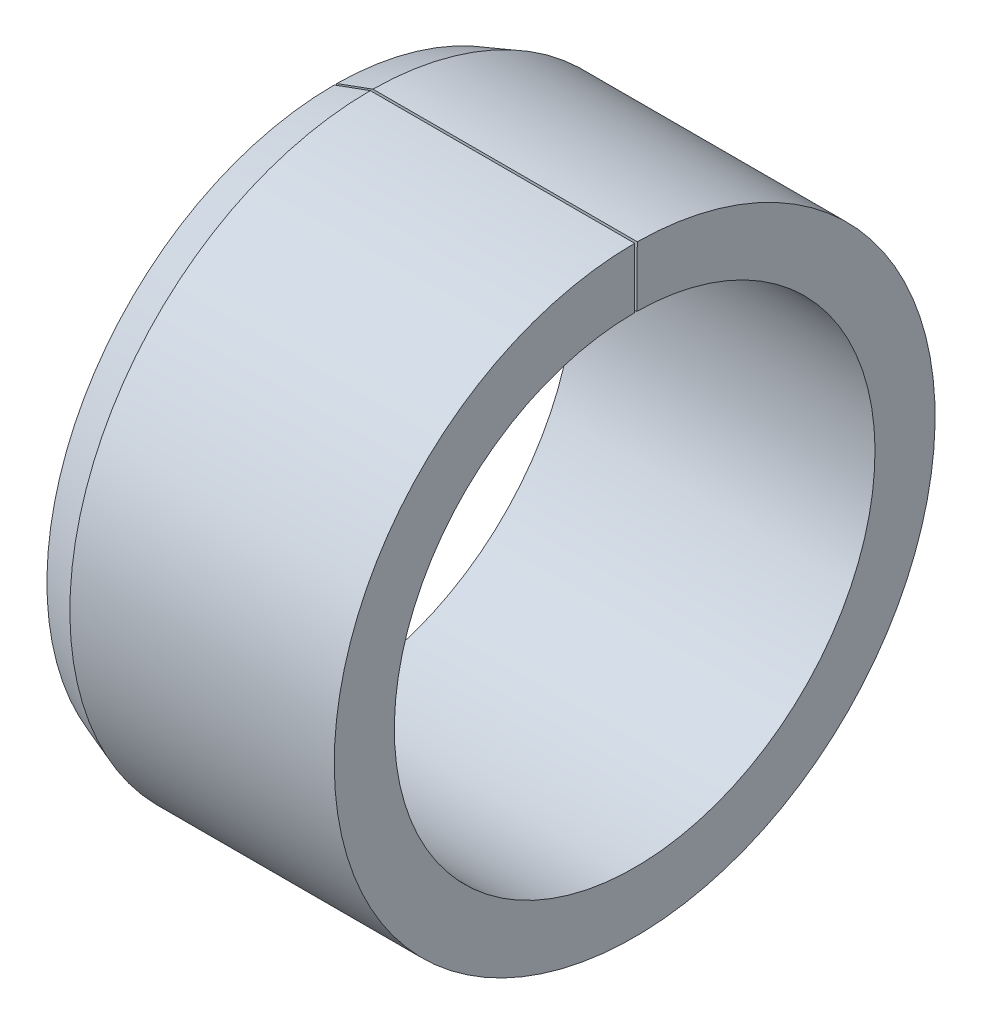
ISO-10303-21;
HEADER;
FILE_DESCRIPTION(('STEP AP214'),'2;1');
FILE_NAME('part.step','',(''),(''),'','','');
FILE_SCHEMA(('AUTOMOTIVE_DESIGN { 1 0 10303 214 1 1 1 1 }'));
ENDSEC;
DATA;
#1=APPLICATION_CONTEXT('core data for automotive mechanical design processes');
#2=APPLICATION_PROTOCOL_DEFINITION('international standard','automotive_design',2000,#1);
#3=PRODUCT_CONTEXT('',#1,'mechanical');
#4=PRODUCT('Part','Part','',(#3));
#5=PRODUCT_RELATED_PRODUCT_CATEGORY('part','',(#4));
#6=PRODUCT_DEFINITION_FORMATION('','',#4);
#7=PRODUCT_DEFINITION_CONTEXT('part definition',#1,'design');
#8=PRODUCT_DEFINITION('design','',#6,#7);
#9=PRODUCT_DEFINITION_SHAPE('','',#8);
#10=(LENGTH_UNIT() NAMED_UNIT(*) SI_UNIT(.MILLI.,.METRE.));
#11=(NAMED_UNIT(*) PLANE_ANGLE_UNIT() SI_UNIT($,.RADIAN.));
#12=(NAMED_UNIT(*) SI_UNIT($,.STERADIAN.) SOLID_ANGLE_UNIT());
#13=UNCERTAINTY_MEASURE_WITH_UNIT(LENGTH_MEASURE(1.E-05),#10,'distance_accuracy_value','');
#14=(GEOMETRIC_REPRESENTATION_CONTEXT(3) GLOBAL_UNCERTAINTY_ASSIGNED_CONTEXT((#13)) GLOBAL_UNIT_ASSIGNED_CONTEXT((#10,
#11,#12)) REPRESENTATION_CONTEXT('',''));
#15=CARTESIAN_POINT('',(0.,0.,0.));
#16=DIRECTION('',(0.,0.,1.));
#17=DIRECTION('',(1.,0.,0.));
#18=AXIS2_PLACEMENT_3D('',#15,#16,#17);
#19=CARTESIAN_POINT('',(5.,2.4665615131487,0.));
#20=DIRECTION('',(0.,0.,1.));
#21=DIRECTION('',(1.,0.,0.));
#22=AXIS2_PLACEMENT_3D('',#19,#20,#21);
#23=PLANE('',#22);
#24=DIRECTION('',(0.,1.,0.));
#25=VECTOR('',#24,1.);
#26=CARTESIAN_POINT('',(5.,2.4665615131487,0.));
#27=LINE('',#26,#25);
#28=CARTESIAN_POINT('',(5.,4.,0.));
#29=VERTEX_POINT('',#28);
#30=CARTESIAN_POINT('',(5.,5.,0.));
#31=VERTEX_POINT('',#30);
#32=EDGE_CURVE('E91',#29,#31,#27,.T.);
#33=ORIENTED_EDGE('',*,*,#32,.F.);
#34=DIRECTION('',(-1.,0.,0.));
#35=VECTOR('',#34,1.);
#36=CARTESIAN_POINT('',(5.,4.,0.));
#37=LINE('',#36,#35);
#38=CARTESIAN_POINT('',(0.,4.,0.));
#39=VERTEX_POINT('',#38);
#40=EDGE_CURVE('E85',#29,#39,#37,.T.);
#41=ORIENTED_EDGE('',*,*,#40,.T.);
#42=DIRECTION('',(0.,1.,0.));
#43=VECTOR('',#42,1.);
#44=CARTESIAN_POINT('',(0.,0.,0.));
#45=LINE('',#44,#43);
#46=CARTESIAN_POINT('',(0.,4.78161785944028,0.));
#47=VERTEX_POINT('',#46);
#48=EDGE_CURVE('E87',#39,#47,#45,.T.);
#49=ORIENTED_EDGE('',*,*,#48,.T.);
#50=DIRECTION('',(-0.939692620785908,-0.342020143325668,0.));
#51=VECTOR('',#50,1.);
#52=CARTESIAN_POINT('',(0.6,5.,0.));
#53=LINE('',#52,#51);
#54=CARTESIAN_POINT('',(0.6,5.,0.));
#55=VERTEX_POINT('',#54);
#56=EDGE_CURVE('E115',#55,#47,#53,.T.);
#57=ORIENTED_EDGE('',*,*,#56,.F.);
#58=DIRECTION('',(1.,0.,0.));
#59=VECTOR('',#58,1.);
#60=CARTESIAN_POINT('',(0.6,5.,0.));
#61=LINE('',#60,#59);
#62=EDGE_CURVE('E47',#55,#31,#61,.T.);
#63=ORIENTED_EDGE('',*,*,#62,.T.);
#64=EDGE_LOOP('',(#33,#41,#49,#57,#63));
#65=FACE_BOUND('',#64,.T.);
#66=ADVANCED_FACE('F39',(#65),#23,.F.);
#67=CARTESIAN_POINT('',(5.,0.,0.));
#68=DIRECTION('',(-1.,0.,0.));
#69=DIRECTION('',(0.,1.,0.));
#70=AXIS2_PLACEMENT_3D('',#67,#68,#69);
#71=CYLINDRICAL_SURFACE('',#70,5.);
#72=DIRECTION('',(1.,0.,0.));
#73=VECTOR('',#72,1.);
#74=CARTESIAN_POINT('',(0.6,4.99980961532086,-0.0436326774918726));
#75=LINE('',#74,#73);
#76=CARTESIAN_POINT('',(0.6,4.99980961532086,-0.0436326774918726));
#77=VERTEX_POINT('',#76);
#78=CARTESIAN_POINT('',(5.,4.99980961532086,-0.0436326774918726));
#79=VERTEX_POINT('',#78);
#80=EDGE_CURVE('E103',#77,#79,#75,.T.);
#81=ORIENTED_EDGE('',*,*,#80,.T.);
#82=CARTESIAN_POINT('',(5.,0.,0.));
#83=DIRECTION('',(1.,0.,0.));
#84=DIRECTION('',(0.,0.,-1.));
#85=AXIS2_PLACEMENT_3D('',#82,#83,#84);
#86=CIRCLE('',#85,5.);
#87=EDGE_CURVE('E123',#31,#79,#86,.T.);
#88=ORIENTED_EDGE('',*,*,#87,.F.);
#89=ORIENTED_EDGE('',*,*,#62,.F.);
#90=CARTESIAN_POINT('',(0.6,0.,0.));
#91=DIRECTION('',(1.,0.,0.));
#92=DIRECTION('',(0.,1.,0.));
#93=AXIS2_PLACEMENT_3D('',#90,#91,#92);
#94=CIRCLE('',#93,5.);
#95=EDGE_CURVE('E113',#55,#77,#94,.T.);
#96=ORIENTED_EDGE('',*,*,#95,.T.);
#97=EDGE_LOOP('',(#81,#88,#89,#96));
#98=FACE_BOUND('',#97,.T.);
#99=ADVANCED_FACE('F124',(#98),#71,.T.);
#100=CARTESIAN_POINT('',(5.,2.46646759404425,-0.0215245366034165));
#101=DIRECTION('',(0.,0.00872653549837452,0.999961923064171));
#102=DIRECTION('',(1.,0.,0.));
#103=AXIS2_PLACEMENT_3D('',#100,#101,#102);
#104=PLANE('',#103);
#105=DIRECTION('',(1.,0.,0.));
#106=VECTOR('',#105,1.);
#107=CARTESIAN_POINT('',(5.,3.99984769225669,-0.0349061419934981));
#108=LINE('',#107,#106);
#109=CARTESIAN_POINT('',(0.,3.99984769225669,-0.0349061419934981));
#110=VERTEX_POINT('',#109);
#111=CARTESIAN_POINT('',(5.,3.99984769225669,-0.0349061419934981));
#112=VERTEX_POINT('',#111);
#113=EDGE_CURVE('E107',#110,#112,#108,.T.);
#114=ORIENTED_EDGE('',*,*,#113,.T.);
#115=DIRECTION('',(0.,0.999961923064171,-0.00872653549837452));
#116=VECTOR('',#115,1.);
#117=CARTESIAN_POINT('',(5.,2.46646759404425,-0.0215245366034165));
#118=LINE('',#117,#116);
#119=EDGE_CURVE('E53',#112,#79,#118,.T.);
#120=ORIENTED_EDGE('',*,*,#119,.T.);
#121=ORIENTED_EDGE('',*,*,#80,.F.);
#122=DIRECTION('',(0.939692620785908,0.342007120246619,-0.00298465092189059));
#123=VECTOR('',#122,1.);
#124=CARTESIAN_POINT('',(0.6,4.99980961532086,-0.0436326774918726));
#125=LINE('',#124,#123);
#126=CARTESIAN_POINT('',(0.,4.78143579008389,-0.0417269579900672));
#127=VERTEX_POINT('',#126);
#128=EDGE_CURVE('E77',#127,#77,#125,.T.);
#129=ORIENTED_EDGE('',*,*,#128,.F.);
#130=DIRECTION('',(0.,0.999961923064171,-0.00872653549837452));
#131=VECTOR('',#130,1.);
#132=CARTESIAN_POINT('',(0.,0.,0.));
#133=LINE('',#132,#131);
#134=EDGE_CURVE('E94',#110,#127,#133,.T.);
#135=ORIENTED_EDGE('',*,*,#134,.F.);
#136=EDGE_LOOP('',(#114,#120,#121,#129,#135));
#137=FACE_BOUND('',#136,.T.);
#138=ADVANCED_FACE('F41',(#137),#104,.T.);
#139=CARTESIAN_POINT('',(5.,0.,0.));
#140=DIRECTION('',(-1.,0.,0.));
#141=DIRECTION('',(0.,0.,-1.));
#142=AXIS2_PLACEMENT_3D('',#139,#140,#141);
#143=CYLINDRICAL_SURFACE('',#142,4.);
#144=CARTESIAN_POINT('',(5.,0.,0.));
#145=DIRECTION('',(1.,0.,0.));
#146=DIRECTION('',(0.,0.,-1.));
#147=AXIS2_PLACEMENT_3D('',#144,#145,#146);
#148=CIRCLE('',#147,4.);
#149=EDGE_CURVE('E11',#112,#29,#148,.F.);
#150=ORIENTED_EDGE('',*,*,#149,.F.);
#151=ORIENTED_EDGE('',*,*,#113,.F.);
#152=CARTESIAN_POINT('',(0.,0.,0.));
#153=DIRECTION('',(1.,0.,0.));
#154=DIRECTION('',(0.,0.,-1.));
#155=AXIS2_PLACEMENT_3D('',#152,#153,#154);
#156=CIRCLE('',#155,4.);
#157=EDGE_CURVE('E95',#39,#110,#156,.T.);
#158=ORIENTED_EDGE('',*,*,#157,.F.);
#159=ORIENTED_EDGE('',*,*,#40,.F.);
#160=EDGE_LOOP('',(#150,#151,#158,#159));
#161=FACE_BOUND('',#160,.T.);
#162=ADVANCED_FACE('F105',(#161),#143,.F.);
#163=CARTESIAN_POINT('',(0.3,0.,0.));
#164=DIRECTION('',(1.,0.,0.));
#165=DIRECTION('',(0.,1.,0.));
#166=AXIS2_PLACEMENT_3D('',#163,#164,#165);
#167=CONICAL_SURFACE('',#166,4.89080892972014,0.349065850398866);
#168=ORIENTED_EDGE('',*,*,#128,.T.);
#169=ORIENTED_EDGE('',*,*,#95,.F.);
#170=ORIENTED_EDGE('',*,*,#56,.T.);
#171=CARTESIAN_POINT('',(0.,0.,0.));
#172=DIRECTION('',(1.,0.,0.));
#173=DIRECTION('',(0.,1.,0.));
#174=AXIS2_PLACEMENT_3D('',#171,#172,#173);
#175=CIRCLE('',#174,4.78161785944028);
#176=EDGE_CURVE('E102',#47,#127,#175,.T.);
#177=ORIENTED_EDGE('',*,*,#176,.T.);
#178=EDGE_LOOP('',(#168,#169,#170,#177));
#179=FACE_BOUND('',#178,.T.);
#180=ADVANCED_FACE('F127',(#179),#167,.T.);
#181=CARTESIAN_POINT('',(0.,2.39080892972014,0.));
#182=DIRECTION('',(-1.,0.,0.));
#183=DIRECTION('',(0.,-1.,0.));
#184=AXIS2_PLACEMENT_3D('',#181,#182,#183);
#185=PLANE('',#184);
#186=ORIENTED_EDGE('',*,*,#157,.T.);
#187=ORIENTED_EDGE('',*,*,#134,.T.);
#188=ORIENTED_EDGE('',*,*,#176,.F.);
#189=ORIENTED_EDGE('',*,*,#48,.F.);
#190=EDGE_LOOP('',(#186,#187,#188,#189));
#191=FACE_BOUND('',#190,.T.);
#192=ADVANCED_FACE('F99',(#191),#185,.T.);
#193=CARTESIAN_POINT('',(5.,0.,0.));
#194=DIRECTION('',(1.,0.,0.));
#195=DIRECTION('',(0.,0.,-1.));
#196=AXIS2_PLACEMENT_3D('',#193,#194,#195);
#197=PLANE('',#196);
#198=ORIENTED_EDGE('',*,*,#32,.T.);
#199=ORIENTED_EDGE('',*,*,#87,.T.);
#200=ORIENTED_EDGE('',*,*,#119,.F.);
#201=ORIENTED_EDGE('',*,*,#149,.T.);
#202=EDGE_LOOP('',(#198,#199,#200,#201));
#203=FACE_BOUND('',#202,.T.);
#204=ADVANCED_FACE('F130',(#203),#197,.T.);
#205=CLOSED_SHELL('',(#66,#99,#138,#162,#180,#192,#204));
#206=MANIFOLD_SOLID_BREP('B2',#205);
#207=ADVANCED_BREP_SHAPE_REPRESENTATION('',(#18,#206),#14);
#208=SHAPE_DEFINITION_REPRESENTATION(#9,#207);
ENDSEC;
END-ISO-10303-21;
